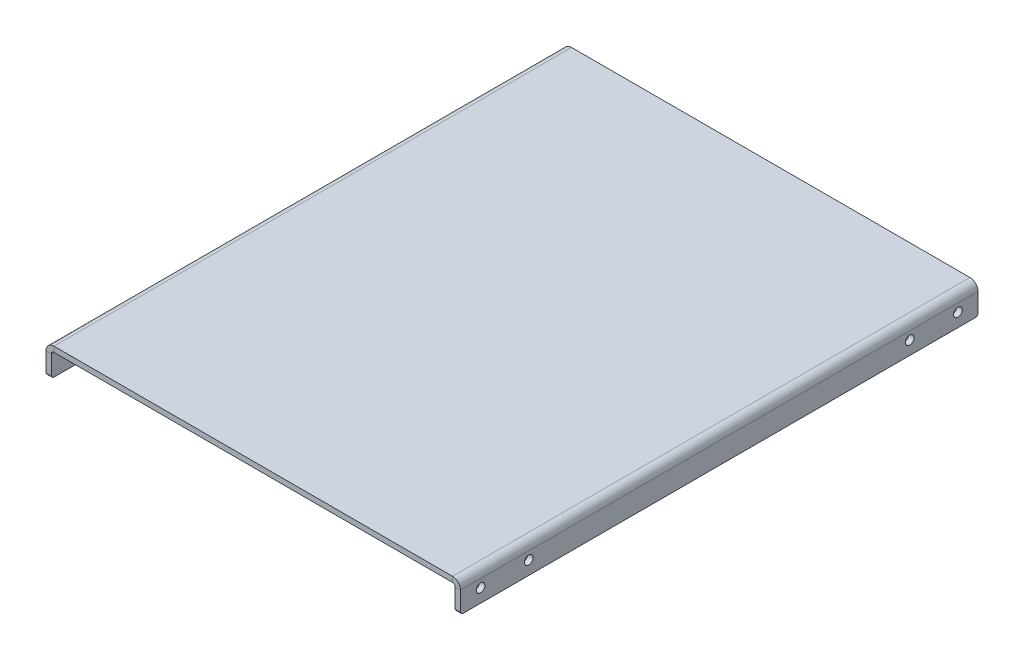
ISO-10303-21;
HEADER;
FILE_DESCRIPTION(('STEP AP214'),'2;1');
FILE_NAME('part.step','',(''),(''),'','','');
FILE_SCHEMA(('AUTOMOTIVE_DESIGN { 1 0 10303 214 1 1 1 1 }'));
ENDSEC;
DATA;
#1=APPLICATION_CONTEXT('core data for automotive mechanical design processes');
#2=APPLICATION_PROTOCOL_DEFINITION('international standard','automotive_design',2000,#1);
#3=PRODUCT_CONTEXT('',#1,'mechanical');
#4=PRODUCT('Part','Part','',(#3));
#5=PRODUCT_RELATED_PRODUCT_CATEGORY('part','',(#4));
#6=PRODUCT_DEFINITION_FORMATION('','',#4);
#7=PRODUCT_DEFINITION_CONTEXT('part definition',#1,'design');
#8=PRODUCT_DEFINITION('design','',#6,#7);
#9=PRODUCT_DEFINITION_SHAPE('','',#8);
#10=(LENGTH_UNIT() NAMED_UNIT(*) SI_UNIT(.MILLI.,.METRE.));
#11=(NAMED_UNIT(*) PLANE_ANGLE_UNIT() SI_UNIT($,.RADIAN.));
#12=(NAMED_UNIT(*) SI_UNIT($,.STERADIAN.) SOLID_ANGLE_UNIT());
#13=UNCERTAINTY_MEASURE_WITH_UNIT(LENGTH_MEASURE(1.E-05),#10,'distance_accuracy_value','');
#14=(GEOMETRIC_REPRESENTATION_CONTEXT(3) GLOBAL_UNCERTAINTY_ASSIGNED_CONTEXT((#13)) GLOBAL_UNIT_ASSIGNED_CONTEXT((#10,
#11,#12)) REPRESENTATION_CONTEXT('',''));
#15=CARTESIAN_POINT('',(0.,0.,0.));
#16=DIRECTION('',(0.,0.,1.));
#17=DIRECTION('',(1.,0.,0.));
#18=AXIS2_PLACEMENT_3D('',#15,#16,#17);
#19=CARTESIAN_POINT('',(-155.,-4.,193.5));
#20=DIRECTION('',(0.,0.,1.));
#21=DIRECTION('',(1.,0.,0.));
#22=AXIS2_PLACEMENT_3D('',#19,#20,#21);
#23=PLANE('',#22);
#24=DIRECTION('',(0.,-1.,0.));
#25=VECTOR('',#24,1.);
#26=CARTESIAN_POINT('',(149.,-4.,193.5));
#27=LINE('',#26,#25);
#28=CARTESIAN_POINT('',(149.,0.,193.5));
#29=VERTEX_POINT('',#28);
#30=CARTESIAN_POINT('',(149.,-4.,193.5));
#31=VERTEX_POINT('',#30);
#32=EDGE_CURVE('E262',#29,#31,#27,.T.);
#33=ORIENTED_EDGE('',*,*,#32,.F.);
#34=DIRECTION('',(1.,0.,0.));
#35=VECTOR('',#34,1.);
#36=CARTESIAN_POINT('',(-155.,0.,193.5));
#37=LINE('',#36,#35);
#38=CARTESIAN_POINT('',(-149.,0.,193.5));
#39=VERTEX_POINT('',#38);
#40=EDGE_CURVE('E237',#39,#29,#37,.T.);
#41=ORIENTED_EDGE('',*,*,#40,.F.);
#42=DIRECTION('',(0.,-1.,0.));
#43=VECTOR('',#42,1.);
#44=CARTESIAN_POINT('',(-149.,-4.,193.5));
#45=LINE('',#44,#43);
#46=CARTESIAN_POINT('',(-149.,-4.,193.5));
#47=VERTEX_POINT('',#46);
#48=EDGE_CURVE('E260',#39,#47,#45,.T.);
#49=ORIENTED_EDGE('',*,*,#48,.T.);
#50=DIRECTION('',(1.,0.,0.));
#51=VECTOR('',#50,1.);
#52=CARTESIAN_POINT('',(-155.,-4.,193.5));
#53=LINE('',#52,#51);
#54=EDGE_CURVE('E186',#47,#31,#53,.T.);
#55=ORIENTED_EDGE('',*,*,#54,.T.);
#56=EDGE_LOOP('',(#33,#41,#49,#55));
#57=FACE_BOUND('',#56,.T.);
#58=ADVANCED_FACE('F39',(#57),#23,.T.);
#59=CARTESIAN_POINT('',(-149.,-6.,193.5));
#60=DIRECTION('',(0.,0.,1.));
#61=DIRECTION('',(1.,0.,0.));
#62=AXIS2_PLACEMENT_3D('',#59,#60,#61);
#63=PLANE('',#62);
#64=ORIENTED_EDGE('',*,*,#48,.F.);
#65=CARTESIAN_POINT('',(-149.,-6.,193.5));
#66=DIRECTION('',(0.,0.,1.));
#67=DIRECTION('',(1.,0.,0.));
#68=AXIS2_PLACEMENT_3D('',#65,#66,#67);
#69=CIRCLE('',#68,6.);
#70=CARTESIAN_POINT('',(-155.,-5.99999999999999,193.5));
#71=VERTEX_POINT('',#70);
#72=EDGE_CURVE('E238',#39,#71,#69,.T.);
#73=ORIENTED_EDGE('',*,*,#72,.T.);
#74=DIRECTION('',(1.,0.,0.));
#75=VECTOR('',#74,1.);
#76=CARTESIAN_POINT('',(-151.,-6.,193.5));
#77=LINE('',#76,#75);
#78=CARTESIAN_POINT('',(-151.,-6.,193.5));
#79=VERTEX_POINT('',#78);
#80=EDGE_CURVE('E257',#71,#79,#77,.T.);
#81=ORIENTED_EDGE('',*,*,#80,.T.);
#82=CARTESIAN_POINT('',(-149.,-6.,193.5));
#83=DIRECTION('',(0.,0.,-1.));
#84=DIRECTION('',(-1.,0.,0.));
#85=AXIS2_PLACEMENT_3D('',#82,#83,#84);
#86=CIRCLE('',#85,2.);
#87=EDGE_CURVE('E177',#47,#79,#86,.F.);
#88=ORIENTED_EDGE('',*,*,#87,.F.);
#89=EDGE_LOOP('',(#64,#73,#81,#88));
#90=FACE_BOUND('',#89,.T.);
#91=ADVANCED_FACE('F436',(#90),#63,.T.);
#92=CARTESIAN_POINT('',(-151.,-22.,193.5));
#93=DIRECTION('',(0.,0.,1.));
#94=DIRECTION('',(0.,1.,0.));
#95=AXIS2_PLACEMENT_3D('',#92,#93,#94);
#96=PLANE('',#95);
#97=DIRECTION('',(0.,1.,0.));
#98=VECTOR('',#97,1.);
#99=CARTESIAN_POINT('',(-155.,-22.,193.5));
#100=LINE('',#99,#98);
#101=CARTESIAN_POINT('',(-155.,-20.,193.5));
#102=VERTEX_POINT('',#101);
#103=EDGE_CURVE('E242',#102,#71,#100,.T.);
#104=ORIENTED_EDGE('',*,*,#103,.F.);
#105=DIRECTION('',(-1.,0.,0.));
#106=VECTOR('',#105,1.);
#107=CARTESIAN_POINT('',(-151.,-20.,193.5));
#108=LINE('',#107,#106);
#109=CARTESIAN_POINT('',(-151.,-20.,193.5));
#110=VERTEX_POINT('',#109);
#111=EDGE_CURVE('E47',#102,#110,#108,.F.);
#112=ORIENTED_EDGE('',*,*,#111,.T.);
#113=DIRECTION('',(0.,1.,0.));
#114=VECTOR('',#113,1.);
#115=CARTESIAN_POINT('',(-151.,-22.,193.5));
#116=LINE('',#115,#114);
#117=EDGE_CURVE('E301',#110,#79,#116,.T.);
#118=ORIENTED_EDGE('',*,*,#117,.T.);
#119=ORIENTED_EDGE('',*,*,#80,.F.);
#120=EDGE_LOOP('',(#104,#112,#118,#119));
#121=FACE_BOUND('',#120,.T.);
#122=ADVANCED_FACE('F299',(#121),#96,.T.);
#123=CARTESIAN_POINT('',(-151.,-22.,193.5));
#124=DIRECTION('',(0.,1.,0.));
#125=DIRECTION('',(0.,0.,-1.));
#126=AXIS2_PLACEMENT_3D('',#123,#124,#125);
#127=PLANE('',#126);
#128=DIRECTION('',(0.,0.,1.));
#129=VECTOR('',#128,1.);
#130=CARTESIAN_POINT('',(-155.,-22.,193.5));
#131=LINE('',#130,#129);
#132=CARTESIAN_POINT('',(-155.,-22.,191.5));
#133=VERTEX_POINT('',#132);
#134=CARTESIAN_POINT('',(-155.,-22.,-191.5));
#135=VERTEX_POINT('',#134);
#136=EDGE_CURVE('E229',#133,#135,#131,.F.);
#137=ORIENTED_EDGE('',*,*,#136,.T.);
#138=DIRECTION('',(-1.,0.,0.));
#139=VECTOR('',#138,1.);
#140=CARTESIAN_POINT('',(-151.,-22.,-191.5));
#141=LINE('',#140,#139);
#142=CARTESIAN_POINT('',(-151.,-22.,-191.5));
#143=VERTEX_POINT('',#142);
#144=EDGE_CURVE('E267',#135,#143,#141,.F.);
#145=ORIENTED_EDGE('',*,*,#144,.T.);
#146=DIRECTION('',(0.,0.,-1.));
#147=VECTOR('',#146,1.);
#148=CARTESIAN_POINT('',(-151.,-22.,193.5));
#149=LINE('',#148,#147);
#150=CARTESIAN_POINT('',(-151.,-22.,191.5));
#151=VERTEX_POINT('',#150);
#152=EDGE_CURVE('E308',#151,#143,#149,.T.);
#153=ORIENTED_EDGE('',*,*,#152,.F.);
#154=DIRECTION('',(1.,0.,0.));
#155=VECTOR('',#154,1.);
#156=CARTESIAN_POINT('',(-151.,-22.,191.5));
#157=LINE('',#156,#155);
#158=EDGE_CURVE('E264',#151,#133,#157,.F.);
#159=ORIENTED_EDGE('',*,*,#158,.T.);
#160=EDGE_LOOP('',(#137,#145,#153,#159));
#161=FACE_BOUND('',#160,.T.);
#162=ADVANCED_FACE('F463',(#161),#127,.F.);
#163=CARTESIAN_POINT('',(-151.,-22.,-193.5));
#164=DIRECTION('',(0.,0.,1.));
#165=DIRECTION('',(0.,1.,0.));
#166=AXIS2_PLACEMENT_3D('',#163,#164,#165);
#167=PLANE('',#166);
#168=DIRECTION('',(0.,1.,0.));
#169=VECTOR('',#168,1.);
#170=CARTESIAN_POINT('',(-151.,-22.,-193.5));
#171=LINE('',#170,#169);
#172=CARTESIAN_POINT('',(-151.,-20.,-193.5));
#173=VERTEX_POINT('',#172);
#174=CARTESIAN_POINT('',(-151.,-6.,-193.5));
#175=VERTEX_POINT('',#174);
#176=EDGE_CURVE('E309',#173,#175,#171,.T.);
#177=ORIENTED_EDGE('',*,*,#176,.F.);
#178=DIRECTION('',(-1.,0.,0.));
#179=VECTOR('',#178,1.);
#180=CARTESIAN_POINT('',(-151.,-20.,-193.5));
#181=LINE('',#180,#179);
#182=CARTESIAN_POINT('',(-155.,-20.,-193.5));
#183=VERTEX_POINT('',#182);
#184=EDGE_CURVE('E274',#173,#183,#181,.T.);
#185=ORIENTED_EDGE('',*,*,#184,.T.);
#186=DIRECTION('',(0.,1.,0.));
#187=VECTOR('',#186,1.);
#188=CARTESIAN_POINT('',(-155.,-22.,-193.5));
#189=LINE('',#188,#187);
#190=CARTESIAN_POINT('',(-155.,-6.,-193.5));
#191=VERTEX_POINT('',#190);
#192=EDGE_CURVE('E240',#183,#191,#189,.T.);
#193=ORIENTED_EDGE('',*,*,#192,.T.);
#194=DIRECTION('',(1.,0.,0.));
#195=VECTOR('',#194,1.);
#196=CARTESIAN_POINT('',(-151.,-6.,-193.5));
#197=LINE('',#196,#195);
#198=EDGE_CURVE('E166',#191,#175,#197,.T.);
#199=ORIENTED_EDGE('',*,*,#198,.T.);
#200=EDGE_LOOP('',(#177,#185,#193,#199));
#201=FACE_BOUND('',#200,.T.);
#202=ADVANCED_FACE('F467',(#201),#167,.F.);
#203=CARTESIAN_POINT('',(-149.,-6.,-193.5));
#204=DIRECTION('',(0.,0.,-1.));
#205=DIRECTION('',(-1.,0.,0.));
#206=AXIS2_PLACEMENT_3D('',#203,#204,#205);
#207=PLANE('',#206);
#208=ORIENTED_EDGE('',*,*,#198,.F.);
#209=CARTESIAN_POINT('',(-149.,-6.,-193.5));
#210=DIRECTION('',(0.,0.,1.));
#211=DIRECTION('',(1.,0.,0.));
#212=AXIS2_PLACEMENT_3D('',#209,#210,#211);
#213=CIRCLE('',#212,6.);
#214=CARTESIAN_POINT('',(-149.,0.,-193.5));
#215=VERTEX_POINT('',#214);
#216=EDGE_CURVE('E161',#191,#215,#213,.F.);
#217=ORIENTED_EDGE('',*,*,#216,.T.);
#218=DIRECTION('',(0.,-1.,0.));
#219=VECTOR('',#218,1.);
#220=CARTESIAN_POINT('',(-149.,-4.,-193.5));
#221=LINE('',#220,#219);
#222=CARTESIAN_POINT('',(-149.,-4.,-193.5));
#223=VERTEX_POINT('',#222);
#224=EDGE_CURVE('E154',#215,#223,#221,.T.);
#225=ORIENTED_EDGE('',*,*,#224,.T.);
#226=CARTESIAN_POINT('',(-149.,-6.,-193.5));
#227=DIRECTION('',(0.,0.,1.));
#228=DIRECTION('',(1.,0.,0.));
#229=AXIS2_PLACEMENT_3D('',#226,#227,#228);
#230=CIRCLE('',#229,2.);
#231=EDGE_CURVE('E158',#175,#223,#230,.F.);
#232=ORIENTED_EDGE('',*,*,#231,.F.);
#233=EDGE_LOOP('',(#208,#217,#225,#232));
#234=FACE_BOUND('',#233,.T.);
#235=ADVANCED_FACE('F157',(#234),#207,.T.);
#236=CARTESIAN_POINT('',(-155.,-4.,-193.5));
#237=DIRECTION('',(0.,0.,1.));
#238=DIRECTION('',(1.,0.,0.));
#239=AXIS2_PLACEMENT_3D('',#236,#237,#238);
#240=PLANE('',#239);
#241=ORIENTED_EDGE('',*,*,#224,.F.);
#242=DIRECTION('',(1.,0.,0.));
#243=VECTOR('',#242,1.);
#244=CARTESIAN_POINT('',(-155.,0.,-193.5));
#245=LINE('',#244,#243);
#246=CARTESIAN_POINT('',(149.,0.,-193.5));
#247=VERTEX_POINT('',#246);
#248=EDGE_CURVE('E235',#215,#247,#245,.T.);
#249=ORIENTED_EDGE('',*,*,#248,.T.);
#250=DIRECTION('',(0.,-1.,0.));
#251=VECTOR('',#250,1.);
#252=CARTESIAN_POINT('',(149.,-4.,-193.5));
#253=LINE('',#252,#251);
#254=CARTESIAN_POINT('',(149.,-4.,-193.5));
#255=VERTEX_POINT('',#254);
#256=EDGE_CURVE('E167',#247,#255,#253,.T.);
#257=ORIENTED_EDGE('',*,*,#256,.T.);
#258=DIRECTION('',(1.,0.,0.));
#259=VECTOR('',#258,1.);
#260=CARTESIAN_POINT('',(-155.,-4.,-193.5));
#261=LINE('',#260,#259);
#262=EDGE_CURVE('E181',#223,#255,#261,.T.);
#263=ORIENTED_EDGE('',*,*,#262,.F.);
#264=EDGE_LOOP('',(#241,#249,#257,#263));
#265=FACE_BOUND('',#264,.T.);
#266=ADVANCED_FACE('F182',(#265),#240,.F.);
#267=CARTESIAN_POINT('',(149.,-6.,-193.5));
#268=DIRECTION('',(0.,0.,1.));
#269=DIRECTION('',(1.,0.,0.));
#270=AXIS2_PLACEMENT_3D('',#267,#268,#269);
#271=PLANE('',#270);
#272=ORIENTED_EDGE('',*,*,#256,.F.);
#273=CARTESIAN_POINT('',(149.,-6.,-193.5));
#274=DIRECTION('',(0.,0.,1.));
#275=DIRECTION('',(1.,0.,0.));
#276=AXIS2_PLACEMENT_3D('',#273,#274,#275);
#277=CIRCLE('',#276,6.);
#278=CARTESIAN_POINT('',(155.,-6.,-193.5));
#279=VERTEX_POINT('',#278);
#280=EDGE_CURVE('E230',#247,#279,#277,.F.);
#281=ORIENTED_EDGE('',*,*,#280,.T.);
#282=DIRECTION('',(-1.,0.,0.));
#283=VECTOR('',#282,1.);
#284=CARTESIAN_POINT('',(151.,-6.,-193.5));
#285=LINE('',#284,#283);
#286=CARTESIAN_POINT('',(151.,-6.,-193.5));
#287=VERTEX_POINT('',#286);
#288=EDGE_CURVE('E252',#279,#287,#285,.T.);
#289=ORIENTED_EDGE('',*,*,#288,.T.);
#290=CARTESIAN_POINT('',(149.,-6.,-193.5));
#291=DIRECTION('',(0.,0.,-1.));
#292=DIRECTION('',(-1.,0.,0.));
#293=AXIS2_PLACEMENT_3D('',#290,#291,#292);
#294=CIRCLE('',#293,2.);
#295=EDGE_CURVE('E206',#255,#287,#294,.T.);
#296=ORIENTED_EDGE('',*,*,#295,.F.);
#297=EDGE_LOOP('',(#272,#281,#289,#296));
#298=FACE_BOUND('',#297,.T.);
#299=ADVANCED_FACE('F494',(#298),#271,.F.);
#300=CARTESIAN_POINT('',(151.,0.,-193.5));
#301=DIRECTION('',(0.,0.,-1.));
#302=DIRECTION('',(0.,1.,0.));
#303=AXIS2_PLACEMENT_3D('',#300,#301,#302);
#304=PLANE('',#303);
#305=DIRECTION('',(0.,1.,0.));
#306=VECTOR('',#305,1.);
#307=CARTESIAN_POINT('',(155.,0.,-193.5));
#308=LINE('',#307,#306);
#309=CARTESIAN_POINT('',(155.,-20.,-193.5));
#310=VERTEX_POINT('',#309);
#311=EDGE_CURVE('E226',#279,#310,#308,.F.);
#312=ORIENTED_EDGE('',*,*,#311,.T.);
#313=DIRECTION('',(-1.,0.,0.));
#314=VECTOR('',#313,1.);
#315=CARTESIAN_POINT('',(151.,-20.,-193.5));
#316=LINE('',#315,#314);
#317=CARTESIAN_POINT('',(151.,-20.,-193.5));
#318=VERTEX_POINT('',#317);
#319=EDGE_CURVE('E280',#310,#318,#316,.T.);
#320=ORIENTED_EDGE('',*,*,#319,.T.);
#321=DIRECTION('',(0.,1.,0.));
#322=VECTOR('',#321,1.);
#323=CARTESIAN_POINT('',(151.,0.,-193.5));
#324=LINE('',#323,#322);
#325=EDGE_CURVE('E311',#287,#318,#324,.F.);
#326=ORIENTED_EDGE('',*,*,#325,.F.);
#327=ORIENTED_EDGE('',*,*,#288,.F.);
#328=EDGE_LOOP('',(#312,#320,#326,#327));
#329=FACE_BOUND('',#328,.T.);
#330=ADVANCED_FACE('F330',(#329),#304,.T.);
#331=CARTESIAN_POINT('',(151.,-22.,193.5));
#332=DIRECTION('',(0.,-1.,0.));
#333=DIRECTION('',(0.,0.,-1.));
#334=AXIS2_PLACEMENT_3D('',#331,#332,#333);
#335=PLANE('',#334);
#336=DIRECTION('',(0.,0.,-1.));
#337=VECTOR('',#336,1.);
#338=CARTESIAN_POINT('',(151.,-22.,193.5));
#339=LINE('',#338,#337);
#340=CARTESIAN_POINT('',(151.,-22.,191.5));
#341=VERTEX_POINT('',#340);
#342=CARTESIAN_POINT('',(151.,-22.,-191.5));
#343=VERTEX_POINT('',#342);
#344=EDGE_CURVE('E196',#341,#343,#339,.T.);
#345=ORIENTED_EDGE('',*,*,#344,.T.);
#346=DIRECTION('',(-1.,0.,0.));
#347=VECTOR('',#346,1.);
#348=CARTESIAN_POINT('',(151.,-22.,-191.5));
#349=LINE('',#348,#347);
#350=CARTESIAN_POINT('',(155.,-22.,-191.5));
#351=VERTEX_POINT('',#350);
#352=EDGE_CURVE('E60',#343,#351,#349,.F.);
#353=ORIENTED_EDGE('',*,*,#352,.T.);
#354=DIRECTION('',(0.,0.,-1.));
#355=VECTOR('',#354,1.);
#356=CARTESIAN_POINT('',(155.,-22.,193.5));
#357=LINE('',#356,#355);
#358=CARTESIAN_POINT('',(155.,-22.,191.5));
#359=VERTEX_POINT('',#358);
#360=EDGE_CURVE('E224',#359,#351,#357,.T.);
#361=ORIENTED_EDGE('',*,*,#360,.F.);
#362=DIRECTION('',(1.,0.,0.));
#363=VECTOR('',#362,1.);
#364=CARTESIAN_POINT('',(151.,-22.,191.5));
#365=LINE('',#364,#363);
#366=EDGE_CURVE('E287',#359,#341,#365,.F.);
#367=ORIENTED_EDGE('',*,*,#366,.T.);
#368=EDGE_LOOP('',(#345,#353,#361,#367));
#369=FACE_BOUND('',#368,.T.);
#370=ADVANCED_FACE('F318',(#369),#335,.T.);
#371=CARTESIAN_POINT('',(151.,0.,193.5));
#372=DIRECTION('',(0.,0.,-1.));
#373=DIRECTION('',(0.,1.,0.));
#374=AXIS2_PLACEMENT_3D('',#371,#372,#373);
#375=PLANE('',#374);
#376=DIRECTION('',(0.,1.,0.));
#377=VECTOR('',#376,1.);
#378=CARTESIAN_POINT('',(151.,0.,193.5));
#379=LINE('',#378,#377);
#380=CARTESIAN_POINT('',(151.,-6.,193.5));
#381=VERTEX_POINT('',#380);
#382=CARTESIAN_POINT('',(151.,-20.,193.5));
#383=VERTEX_POINT('',#382);
#384=EDGE_CURVE('E192',#381,#383,#379,.F.);
#385=ORIENTED_EDGE('',*,*,#384,.T.);
#386=DIRECTION('',(-1.,0.,0.));
#387=VECTOR('',#386,1.);
#388=CARTESIAN_POINT('',(151.,-20.,193.5));
#389=LINE('',#388,#387);
#390=CARTESIAN_POINT('',(155.,-20.,193.5));
#391=VERTEX_POINT('',#390);
#392=EDGE_CURVE('E11',#383,#391,#389,.F.);
#393=ORIENTED_EDGE('',*,*,#392,.T.);
#394=DIRECTION('',(0.,1.,0.));
#395=VECTOR('',#394,1.);
#396=CARTESIAN_POINT('',(155.,0.,193.5));
#397=LINE('',#396,#395);
#398=CARTESIAN_POINT('',(155.,-6.,193.5));
#399=VERTEX_POINT('',#398);
#400=EDGE_CURVE('E220',#399,#391,#397,.F.);
#401=ORIENTED_EDGE('',*,*,#400,.F.);
#402=DIRECTION('',(-1.,0.,0.));
#403=VECTOR('',#402,1.);
#404=CARTESIAN_POINT('',(151.,-6.,193.5));
#405=LINE('',#404,#403);
#406=EDGE_CURVE('E205',#399,#381,#405,.T.);
#407=ORIENTED_EDGE('',*,*,#406,.T.);
#408=EDGE_LOOP('',(#385,#393,#401,#407));
#409=FACE_BOUND('',#408,.T.);
#410=ADVANCED_FACE('F342',(#409),#375,.F.);
#411=CARTESIAN_POINT('',(149.,-6.,193.5));
#412=DIRECTION('',(0.,0.,-1.));
#413=DIRECTION('',(-1.,0.,0.));
#414=AXIS2_PLACEMENT_3D('',#411,#412,#413);
#415=PLANE('',#414);
#416=CARTESIAN_POINT('',(149.,-6.,193.5));
#417=DIRECTION('',(0.,0.,1.));
#418=DIRECTION('',(1.,0.,0.));
#419=AXIS2_PLACEMENT_3D('',#416,#417,#418);
#420=CIRCLE('',#419,6.);
#421=EDGE_CURVE('E233',#399,#29,#420,.T.);
#422=ORIENTED_EDGE('',*,*,#421,.T.);
#423=ORIENTED_EDGE('',*,*,#32,.T.);
#424=CARTESIAN_POINT('',(149.,-6.,193.5));
#425=DIRECTION('',(0.,0.,1.));
#426=DIRECTION('',(1.,0.,0.));
#427=AXIS2_PLACEMENT_3D('',#424,#425,#426);
#428=CIRCLE('',#427,2.);
#429=EDGE_CURVE('E178',#381,#31,#428,.T.);
#430=ORIENTED_EDGE('',*,*,#429,.F.);
#431=ORIENTED_EDGE('',*,*,#406,.F.);
#432=EDGE_LOOP('',(#422,#423,#430,#431));
#433=FACE_BOUND('',#432,.T.);
#434=ADVANCED_FACE('F345',(#433),#415,.F.);
#435=CARTESIAN_POINT('',(151.,0.,193.5));
#436=DIRECTION('',(1.,0.,0.));
#437=DIRECTION('',(0.,0.,-1.));
#438=AXIS2_PLACEMENT_3D('',#435,#436,#437);
#439=PLANE('',#438);
#440=CARTESIAN_POINT('',(151.,-12.,178.5));
#441=DIRECTION('',(1.,0.,0.));
#442=DIRECTION('',(0.,0.,-1.));
#443=AXIS2_PLACEMENT_3D('',#440,#441,#442);
#444=CIRCLE('',#443,3.24999999999994);
#445=CARTESIAN_POINT('',(151.,-12.,175.25));
#446=VERTEX_POINT('',#445);
#447=EDGE_CURVE('E387',#446,#446,#444,.T.);
#448=ORIENTED_EDGE('',*,*,#447,.T.);
#449=EDGE_LOOP('',(#448));
#450=FACE_BOUND('',#449,.T.);
#451=CARTESIAN_POINT('',(151.,-12.,142.5));
#452=DIRECTION('',(1.,0.,0.));
#453=DIRECTION('',(0.,0.,-1.));
#454=AXIS2_PLACEMENT_3D('',#451,#452,#453);
#455=CIRCLE('',#454,3.24999999999994);
#456=CARTESIAN_POINT('',(151.,-12.,139.25));
#457=VERTEX_POINT('',#456);
#458=EDGE_CURVE('E375',#457,#457,#455,.T.);
#459=ORIENTED_EDGE('',*,*,#458,.T.);
#460=EDGE_LOOP('',(#459));
#461=FACE_BOUND('',#460,.T.);
#462=CARTESIAN_POINT('',(151.,-12.,-142.5));
#463=DIRECTION('',(1.,0.,0.));
#464=DIRECTION('',(0.,0.,-1.));
#465=AXIS2_PLACEMENT_3D('',#462,#463,#464);
#466=CIRCLE('',#465,3.24999999999994);
#467=CARTESIAN_POINT('',(151.,-12.,-145.75));
#468=VERTEX_POINT('',#467);
#469=EDGE_CURVE('E363',#468,#468,#466,.T.);
#470=ORIENTED_EDGE('',*,*,#469,.T.);
#471=EDGE_LOOP('',(#470));
#472=FACE_BOUND('',#471,.T.);
#473=CARTESIAN_POINT('',(151.,-12.,-178.5));
#474=DIRECTION('',(1.,0.,0.));
#475=DIRECTION('',(0.,0.,-1.));
#476=AXIS2_PLACEMENT_3D('',#473,#474,#475);
#477=CIRCLE('',#476,3.24999999999994);
#478=CARTESIAN_POINT('',(151.,-12.,-181.75));
#479=VERTEX_POINT('',#478);
#480=EDGE_CURVE('E234',#479,#479,#477,.T.);
#481=ORIENTED_EDGE('',*,*,#480,.T.);
#482=EDGE_LOOP('',(#481));
#483=FACE_BOUND('',#482,.T.);
#484=ORIENTED_EDGE('',*,*,#325,.T.);
#485=CARTESIAN_POINT('',(151.,-20.,-191.5));
#486=DIRECTION('',(1.,0.,0.));
#487=DIRECTION('',(0.,0.,-1.));
#488=AXIS2_PLACEMENT_3D('',#485,#486,#487);
#489=CIRCLE('',#488,2.);
#490=EDGE_CURVE('E285',#318,#343,#489,.F.);
#491=ORIENTED_EDGE('',*,*,#490,.T.);
#492=ORIENTED_EDGE('',*,*,#344,.F.);
#493=CARTESIAN_POINT('',(151.,-20.,191.5));
#494=DIRECTION('',(1.,0.,0.));
#495=DIRECTION('',(0.,0.,-1.));
#496=AXIS2_PLACEMENT_3D('',#493,#494,#495);
#497=CIRCLE('',#496,2.);
#498=EDGE_CURVE('E283',#341,#383,#497,.F.);
#499=ORIENTED_EDGE('',*,*,#498,.T.);
#500=ORIENTED_EDGE('',*,*,#384,.F.);
#501=DIRECTION('',(0.,0.,-1.));
#502=VECTOR('',#501,1.);
#503=CARTESIAN_POINT('',(151.,-6.,-193.5));
#504=LINE('',#503,#502);
#505=EDGE_CURVE('E194',#381,#287,#504,.T.);
#506=ORIENTED_EDGE('',*,*,#505,.T.);
#507=EDGE_LOOP('',(#484,#491,#492,#499,#500,#506));
#508=FACE_BOUND('',#507,.T.);
#509=ADVANCED_FACE('F340',(#450,#461,#472,#483,#508),#439,.F.);
#510=CARTESIAN_POINT('',(-151.,-22.,193.5));
#511=DIRECTION('',(-1.,0.,0.));
#512=DIRECTION('',(0.,0.,1.));
#513=AXIS2_PLACEMENT_3D('',#510,#511,#512);
#514=PLANE('',#513);
#515=CARTESIAN_POINT('',(-151.,-12.,178.5));
#516=DIRECTION('',(-1.,0.,0.));
#517=DIRECTION('',(0.,0.,1.));
#518=AXIS2_PLACEMENT_3D('',#515,#516,#517);
#519=CIRCLE('',#518,3.24999999999994);
#520=CARTESIAN_POINT('',(-151.,-12.,181.75));
#521=VERTEX_POINT('',#520);
#522=EDGE_CURVE('E393',#521,#521,#519,.T.);
#523=ORIENTED_EDGE('',*,*,#522,.T.);
#524=EDGE_LOOP('',(#523));
#525=FACE_BOUND('',#524,.T.);
#526=CARTESIAN_POINT('',(-151.,-12.,142.5));
#527=DIRECTION('',(-1.,0.,0.));
#528=DIRECTION('',(0.,0.,1.));
#529=AXIS2_PLACEMENT_3D('',#526,#527,#528);
#530=CIRCLE('',#529,3.24999999999994);
#531=CARTESIAN_POINT('',(-151.,-12.,145.75));
#532=VERTEX_POINT('',#531);
#533=EDGE_CURVE('E378',#532,#532,#530,.T.);
#534=ORIENTED_EDGE('',*,*,#533,.T.);
#535=EDGE_LOOP('',(#534));
#536=FACE_BOUND('',#535,.T.);
#537=CARTESIAN_POINT('',(-151.,-12.,-142.5));
#538=DIRECTION('',(-1.,0.,0.));
#539=DIRECTION('',(0.,0.,1.));
#540=AXIS2_PLACEMENT_3D('',#537,#538,#539);
#541=CIRCLE('',#540,3.24999999999994);
#542=CARTESIAN_POINT('',(-151.,-12.,-139.25));
#543=VERTEX_POINT('',#542);
#544=EDGE_CURVE('E369',#543,#543,#541,.T.);
#545=ORIENTED_EDGE('',*,*,#544,.T.);
#546=EDGE_LOOP('',(#545));
#547=FACE_BOUND('',#546,.T.);
#548=CARTESIAN_POINT('',(-151.,-12.,-178.5));
#549=DIRECTION('',(-1.,0.,0.));
#550=DIRECTION('',(0.,0.,1.));
#551=AXIS2_PLACEMENT_3D('',#548,#549,#550);
#552=CIRCLE('',#551,3.24999999999994);
#553=CARTESIAN_POINT('',(-151.,-12.,-175.25));
#554=VERTEX_POINT('',#553);
#555=EDGE_CURVE('E357',#554,#554,#552,.T.);
#556=ORIENTED_EDGE('',*,*,#555,.T.);
#557=EDGE_LOOP('',(#556));
#558=FACE_BOUND('',#557,.T.);
#559=ORIENTED_EDGE('',*,*,#152,.T.);
#560=CARTESIAN_POINT('',(-151.,-20.,-191.5));
#561=DIRECTION('',(-1.,0.,0.));
#562=DIRECTION('',(0.,0.,1.));
#563=AXIS2_PLACEMENT_3D('',#560,#561,#562);
#564=CIRCLE('',#563,2.);
#565=EDGE_CURVE('E272',#143,#173,#564,.F.);
#566=ORIENTED_EDGE('',*,*,#565,.T.);
#567=ORIENTED_EDGE('',*,*,#176,.T.);
#568=DIRECTION('',(0.,0.,-1.));
#569=VECTOR('',#568,1.);
#570=CARTESIAN_POINT('',(-151.,-6.,193.5));
#571=LINE('',#570,#569);
#572=EDGE_CURVE('E176',#175,#79,#571,.F.);
#573=ORIENTED_EDGE('',*,*,#572,.T.);
#574=ORIENTED_EDGE('',*,*,#117,.F.);
#575=CARTESIAN_POINT('',(-151.,-20.,191.5));
#576=DIRECTION('',(-1.,0.,0.));
#577=DIRECTION('',(0.,0.,1.));
#578=AXIS2_PLACEMENT_3D('',#575,#576,#577);
#579=CIRCLE('',#578,2.);
#580=EDGE_CURVE('E270',#110,#151,#579,.F.);
#581=ORIENTED_EDGE('',*,*,#580,.T.);
#582=EDGE_LOOP('',(#559,#566,#567,#573,#574,#581));
#583=FACE_BOUND('',#582,.T.);
#584=ADVANCED_FACE('F306',(#525,#536,#547,#558,#583),#514,.F.);
#585=CARTESIAN_POINT('',(-155.,-4.,193.5));
#586=DIRECTION('',(0.,1.,0.));
#587=DIRECTION('',(0.,0.,1.));
#588=AXIS2_PLACEMENT_3D('',#585,#586,#587);
#589=PLANE('',#588);
#590=ORIENTED_EDGE('',*,*,#262,.T.);
#591=DIRECTION('',(0.,0.,-1.));
#592=VECTOR('',#591,1.);
#593=CARTESIAN_POINT('',(149.,-4.,193.5));
#594=LINE('',#593,#592);
#595=EDGE_CURVE('E203',#255,#31,#594,.F.);
#596=ORIENTED_EDGE('',*,*,#595,.T.);
#597=ORIENTED_EDGE('',*,*,#54,.F.);
#598=DIRECTION('',(0.,0.,-1.));
#599=VECTOR('',#598,1.);
#600=CARTESIAN_POINT('',(-149.,-4.,-193.5));
#601=LINE('',#600,#599);
#602=EDGE_CURVE('E174',#47,#223,#601,.T.);
#603=ORIENTED_EDGE('',*,*,#602,.T.);
#604=EDGE_LOOP('',(#590,#596,#597,#603));
#605=FACE_BOUND('',#604,.T.);
#606=ADVANCED_FACE('F189',(#605),#589,.F.);
#607=CARTESIAN_POINT('',(-149.,-6.,193.5));
#608=DIRECTION('',(0.,0.,1.));
#609=DIRECTION('',(1.,0.,0.));
#610=AXIS2_PLACEMENT_3D('',#607,#608,#609);
#611=CYLINDRICAL_SURFACE('',#610,2.);
#612=ORIENTED_EDGE('',*,*,#87,.T.);
#613=ORIENTED_EDGE('',*,*,#572,.F.);
#614=ORIENTED_EDGE('',*,*,#231,.T.);
#615=ORIENTED_EDGE('',*,*,#602,.F.);
#616=EDGE_LOOP('',(#612,#613,#614,#615));
#617=FACE_BOUND('',#616,.T.);
#618=ADVANCED_FACE('F172',(#617),#611,.F.);
#619=CARTESIAN_POINT('',(149.,-6.,193.5));
#620=DIRECTION('',(0.,0.,1.));
#621=DIRECTION('',(1.,0.,0.));
#622=AXIS2_PLACEMENT_3D('',#619,#620,#621);
#623=CYLINDRICAL_SURFACE('',#622,2.);
#624=ORIENTED_EDGE('',*,*,#429,.T.);
#625=ORIENTED_EDGE('',*,*,#595,.F.);
#626=ORIENTED_EDGE('',*,*,#295,.T.);
#627=ORIENTED_EDGE('',*,*,#505,.F.);
#628=EDGE_LOOP('',(#624,#625,#626,#627));
#629=FACE_BOUND('',#628,.T.);
#630=ADVANCED_FACE('F348',(#629),#623,.F.);
#631=CARTESIAN_POINT('',(155.,0.,193.5));
#632=DIRECTION('',(1.,0.,0.));
#633=DIRECTION('',(0.,0.,-1.));
#634=AXIS2_PLACEMENT_3D('',#631,#632,#633);
#635=PLANE('',#634);
#636=CARTESIAN_POINT('',(155.,-12.,178.5));
#637=DIRECTION('',(1.,0.,0.));
#638=DIRECTION('',(0.,0.,-1.));
#639=AXIS2_PLACEMENT_3D('',#636,#637,#638);
#640=CIRCLE('',#639,3.24999999999994);
#641=CARTESIAN_POINT('',(155.,-12.,175.25));
#642=VERTEX_POINT('',#641);
#643=EDGE_CURVE('E390',#642,#642,#640,.T.);
#644=ORIENTED_EDGE('',*,*,#643,.F.);
#645=EDGE_LOOP('',(#644));
#646=FACE_BOUND('',#645,.T.);
#647=CARTESIAN_POINT('',(155.,-12.,142.5));
#648=DIRECTION('',(1.,0.,0.));
#649=DIRECTION('',(0.,0.,-1.));
#650=AXIS2_PLACEMENT_3D('',#647,#648,#649);
#651=CIRCLE('',#650,3.24999999999994);
#652=CARTESIAN_POINT('',(155.,-12.,139.25));
#653=VERTEX_POINT('',#652);
#654=EDGE_CURVE('E381',#653,#653,#651,.T.);
#655=ORIENTED_EDGE('',*,*,#654,.F.);
#656=EDGE_LOOP('',(#655));
#657=FACE_BOUND('',#656,.T.);
#658=CARTESIAN_POINT('',(155.,-12.,-142.5));
#659=DIRECTION('',(1.,0.,0.));
#660=DIRECTION('',(0.,0.,-1.));
#661=AXIS2_PLACEMENT_3D('',#658,#659,#660);
#662=CIRCLE('',#661,3.24999999999994);
#663=CARTESIAN_POINT('',(155.,-12.,-145.75));
#664=VERTEX_POINT('',#663);
#665=EDGE_CURVE('E366',#664,#664,#662,.T.);
#666=ORIENTED_EDGE('',*,*,#665,.F.);
#667=EDGE_LOOP('',(#666));
#668=FACE_BOUND('',#667,.T.);
#669=CARTESIAN_POINT('',(155.,-12.,-178.5));
#670=DIRECTION('',(1.,0.,0.));
#671=DIRECTION('',(0.,0.,-1.));
#672=AXIS2_PLACEMENT_3D('',#669,#670,#671);
#673=CIRCLE('',#672,3.24999999999994);
#674=CARTESIAN_POINT('',(155.,-12.,-181.75));
#675=VERTEX_POINT('',#674);
#676=EDGE_CURVE('E354',#675,#675,#673,.T.);
#677=ORIENTED_EDGE('',*,*,#676,.F.);
#678=EDGE_LOOP('',(#677));
#679=FACE_BOUND('',#678,.T.);
#680=ORIENTED_EDGE('',*,*,#360,.T.);
#681=CARTESIAN_POINT('',(155.,-20.,-191.5));
#682=DIRECTION('',(1.,0.,0.));
#683=DIRECTION('',(0.,0.,-1.));
#684=AXIS2_PLACEMENT_3D('',#681,#682,#683);
#685=CIRCLE('',#684,2.);
#686=EDGE_CURVE('E293',#351,#310,#685,.T.);
#687=ORIENTED_EDGE('',*,*,#686,.T.);
#688=ORIENTED_EDGE('',*,*,#311,.F.);
#689=DIRECTION('',(0.,0.,-1.));
#690=VECTOR('',#689,1.);
#691=CARTESIAN_POINT('',(155.,-6.,193.5));
#692=LINE('',#691,#690);
#693=EDGE_CURVE('E212',#399,#279,#692,.T.);
#694=ORIENTED_EDGE('',*,*,#693,.F.);
#695=ORIENTED_EDGE('',*,*,#400,.T.);
#696=CARTESIAN_POINT('',(155.,-20.,191.5));
#697=DIRECTION('',(1.,0.,0.));
#698=DIRECTION('',(0.,0.,-1.));
#699=AXIS2_PLACEMENT_3D('',#696,#697,#698);
#700=CIRCLE('',#699,2.);
#701=EDGE_CURVE('E291',#391,#359,#700,.T.);
#702=ORIENTED_EDGE('',*,*,#701,.T.);
#703=EDGE_LOOP('',(#680,#687,#688,#694,#695,#702));
#704=FACE_BOUND('',#703,.T.);
#705=ADVANCED_FACE('F327',(#646,#657,#668,#679,#704),#635,.T.);
#706=CARTESIAN_POINT('',(-155.,-22.,193.5));
#707=DIRECTION('',(-1.,0.,0.));
#708=DIRECTION('',(0.,0.,1.));
#709=AXIS2_PLACEMENT_3D('',#706,#707,#708);
#710=PLANE('',#709);
#711=CARTESIAN_POINT('',(-155.,-12.,178.5));
#712=DIRECTION('',(1.,0.,0.));
#713=DIRECTION('',(0.,0.,-1.));
#714=AXIS2_PLACEMENT_3D('',#711,#712,#713);
#715=CIRCLE('',#714,3.24999999999992);
#716=CARTESIAN_POINT('',(-155.,-12.,175.25));
#717=VERTEX_POINT('',#716);
#718=EDGE_CURVE('E396',#717,#717,#715,.T.);
#719=ORIENTED_EDGE('',*,*,#718,.T.);
#720=EDGE_LOOP('',(#719));
#721=FACE_BOUND('',#720,.T.);
#722=CARTESIAN_POINT('',(-155.,-12.,142.5));
#723=DIRECTION('',(1.,0.,0.));
#724=DIRECTION('',(0.,0.,-1.));
#725=AXIS2_PLACEMENT_3D('',#722,#723,#724);
#726=CIRCLE('',#725,3.24999999999992);
#727=CARTESIAN_POINT('',(-155.,-12.,139.25));
#728=VERTEX_POINT('',#727);
#729=EDGE_CURVE('E384',#728,#728,#726,.T.);
#730=ORIENTED_EDGE('',*,*,#729,.T.);
#731=EDGE_LOOP('',(#730));
#732=FACE_BOUND('',#731,.T.);
#733=CARTESIAN_POINT('',(-155.,-12.,-142.5));
#734=DIRECTION('',(1.,0.,0.));
#735=DIRECTION('',(0.,0.,-1.));
#736=AXIS2_PLACEMENT_3D('',#733,#734,#735);
#737=CIRCLE('',#736,3.24999999999992);
#738=CARTESIAN_POINT('',(-155.,-12.,-145.75));
#739=VERTEX_POINT('',#738);
#740=EDGE_CURVE('E372',#739,#739,#737,.T.);
#741=ORIENTED_EDGE('',*,*,#740,.T.);
#742=EDGE_LOOP('',(#741));
#743=FACE_BOUND('',#742,.T.);
#744=CARTESIAN_POINT('',(-155.,-12.,-178.5));
#745=DIRECTION('',(1.,0.,0.));
#746=DIRECTION('',(0.,0.,-1.));
#747=AXIS2_PLACEMENT_3D('',#744,#745,#746);
#748=CIRCLE('',#747,3.24999999999992);
#749=CARTESIAN_POINT('',(-155.,-12.,-181.75));
#750=VERTEX_POINT('',#749);
#751=EDGE_CURVE('E360',#750,#750,#748,.T.);
#752=ORIENTED_EDGE('',*,*,#751,.T.);
#753=EDGE_LOOP('',(#752));
#754=FACE_BOUND('',#753,.T.);
#755=ORIENTED_EDGE('',*,*,#192,.F.);
#756=CARTESIAN_POINT('',(-155.,-20.,-191.5));
#757=DIRECTION('',(-1.,0.,0.));
#758=DIRECTION('',(0.,0.,1.));
#759=AXIS2_PLACEMENT_3D('',#756,#757,#758);
#760=CIRCLE('',#759,2.);
#761=EDGE_CURVE('E278',#183,#135,#760,.T.);
#762=ORIENTED_EDGE('',*,*,#761,.T.);
#763=ORIENTED_EDGE('',*,*,#136,.F.);
#764=CARTESIAN_POINT('',(-155.,-20.,191.5));
#765=DIRECTION('',(-1.,0.,0.));
#766=DIRECTION('',(0.,0.,1.));
#767=AXIS2_PLACEMENT_3D('',#764,#765,#766);
#768=CIRCLE('',#767,2.);
#769=EDGE_CURVE('E276',#133,#102,#768,.T.);
#770=ORIENTED_EDGE('',*,*,#769,.T.);
#771=ORIENTED_EDGE('',*,*,#103,.T.);
#772=DIRECTION('',(0.,0.,1.));
#773=VECTOR('',#772,1.);
#774=CARTESIAN_POINT('',(-155.,-6.,193.5));
#775=LINE('',#774,#773);
#776=EDGE_CURVE('E215',#191,#71,#775,.T.);
#777=ORIENTED_EDGE('',*,*,#776,.F.);
#778=EDGE_LOOP('',(#755,#762,#763,#770,#771,#777));
#779=FACE_BOUND('',#778,.T.);
#780=ADVANCED_FACE('F400',(#721,#732,#743,#754,#779),#710,.T.);
#781=CARTESIAN_POINT('',(-155.,0.,193.5));
#782=DIRECTION('',(0.,1.,0.));
#783=DIRECTION('',(0.,0.,1.));
#784=AXIS2_PLACEMENT_3D('',#781,#782,#783);
#785=PLANE('',#784);
#786=ORIENTED_EDGE('',*,*,#248,.F.);
#787=DIRECTION('',(0.,0.,1.));
#788=VECTOR('',#787,1.);
#789=CARTESIAN_POINT('',(-149.,0.,193.5));
#790=LINE('',#789,#788);
#791=EDGE_CURVE('E218',#39,#215,#790,.F.);
#792=ORIENTED_EDGE('',*,*,#791,.F.);
#793=ORIENTED_EDGE('',*,*,#40,.T.);
#794=DIRECTION('',(0.,0.,1.));
#795=VECTOR('',#794,1.);
#796=CARTESIAN_POINT('',(149.,0.,193.5));
#797=LINE('',#796,#795);
#798=EDGE_CURVE('E209',#247,#29,#797,.T.);
#799=ORIENTED_EDGE('',*,*,#798,.F.);
#800=EDGE_LOOP('',(#786,#792,#793,#799));
#801=FACE_BOUND('',#800,.T.);
#802=ADVANCED_FACE('F475',(#801),#785,.T.);
#803=CARTESIAN_POINT('',(-149.,-6.,193.5));
#804=DIRECTION('',(0.,0.,1.));
#805=DIRECTION('',(1.,0.,0.));
#806=AXIS2_PLACEMENT_3D('',#803,#804,#805);
#807=CYLINDRICAL_SURFACE('',#806,6.);
#808=ORIENTED_EDGE('',*,*,#72,.F.);
#809=ORIENTED_EDGE('',*,*,#791,.T.);
#810=ORIENTED_EDGE('',*,*,#216,.F.);
#811=ORIENTED_EDGE('',*,*,#776,.T.);
#812=EDGE_LOOP('',(#808,#809,#810,#811));
#813=FACE_BOUND('',#812,.T.);
#814=ADVANCED_FACE('F470',(#813),#807,.T.);
#815=CARTESIAN_POINT('',(149.,-6.,193.5));
#816=DIRECTION('',(0.,0.,1.));
#817=DIRECTION('',(1.,0.,0.));
#818=AXIS2_PLACEMENT_3D('',#815,#816,#817);
#819=CYLINDRICAL_SURFACE('',#818,6.);
#820=ORIENTED_EDGE('',*,*,#421,.F.);
#821=ORIENTED_EDGE('',*,*,#693,.T.);
#822=ORIENTED_EDGE('',*,*,#280,.F.);
#823=ORIENTED_EDGE('',*,*,#798,.T.);
#824=EDGE_LOOP('',(#820,#821,#822,#823));
#825=FACE_BOUND('',#824,.T.);
#826=ADVANCED_FACE('F336',(#825),#819,.T.);
#827=CARTESIAN_POINT('',(-151.,-20.,-191.5));
#828=DIRECTION('',(1.,0.,0.));
#829=DIRECTION('',(0.,0.,-1.));
#830=AXIS2_PLACEMENT_3D('',#827,#828,#829);
#831=CYLINDRICAL_SURFACE('',#830,2.);
#832=ORIENTED_EDGE('',*,*,#761,.F.);
#833=ORIENTED_EDGE('',*,*,#184,.F.);
#834=ORIENTED_EDGE('',*,*,#565,.F.);
#835=ORIENTED_EDGE('',*,*,#144,.F.);
#836=EDGE_LOOP('',(#832,#833,#834,#835));
#837=FACE_BOUND('',#836,.T.);
#838=ADVANCED_FACE('F447',(#837),#831,.T.);
#839=CARTESIAN_POINT('',(151.,-20.,-191.5));
#840=DIRECTION('',(-1.,0.,0.));
#841=DIRECTION('',(0.,0.,1.));
#842=AXIS2_PLACEMENT_3D('',#839,#840,#841);
#843=CYLINDRICAL_SURFACE('',#842,2.);
#844=ORIENTED_EDGE('',*,*,#686,.F.);
#845=ORIENTED_EDGE('',*,*,#352,.F.);
#846=ORIENTED_EDGE('',*,*,#490,.F.);
#847=ORIENTED_EDGE('',*,*,#319,.F.);
#848=EDGE_LOOP('',(#844,#845,#846,#847));
#849=FACE_BOUND('',#848,.T.);
#850=ADVANCED_FACE('F323',(#849),#843,.T.);
#851=CARTESIAN_POINT('',(-151.,-20.,191.5));
#852=DIRECTION('',(-1.,0.,0.));
#853=DIRECTION('',(0.,0.,1.));
#854=AXIS2_PLACEMENT_3D('',#851,#852,#853);
#855=CYLINDRICAL_SURFACE('',#854,2.);
#856=ORIENTED_EDGE('',*,*,#769,.F.);
#857=ORIENTED_EDGE('',*,*,#158,.F.);
#858=ORIENTED_EDGE('',*,*,#580,.F.);
#859=ORIENTED_EDGE('',*,*,#111,.F.);
#860=EDGE_LOOP('',(#856,#857,#858,#859));
#861=FACE_BOUND('',#860,.T.);
#862=ADVANCED_FACE('F431',(#861),#855,.T.);
#863=CARTESIAN_POINT('',(151.,-20.,191.5));
#864=DIRECTION('',(1.,0.,0.));
#865=DIRECTION('',(0.,0.,-1.));
#866=AXIS2_PLACEMENT_3D('',#863,#864,#865);
#867=CYLINDRICAL_SURFACE('',#866,2.);
#868=ORIENTED_EDGE('',*,*,#701,.F.);
#869=ORIENTED_EDGE('',*,*,#392,.F.);
#870=ORIENTED_EDGE('',*,*,#498,.F.);
#871=ORIENTED_EDGE('',*,*,#366,.F.);
#872=EDGE_LOOP('',(#868,#869,#870,#871));
#873=FACE_BOUND('',#872,.T.);
#874=ADVANCED_FACE('F41',(#873),#867,.T.);
#875=CARTESIAN_POINT('',(159.,-12.,-178.5));
#876=DIRECTION('',(1.,0.,0.));
#877=DIRECTION('',(0.,0.,-1.));
#878=AXIS2_PLACEMENT_3D('',#875,#876,#877);
#879=CYLINDRICAL_SURFACE('',#878,3.24999999999994);
#880=ORIENTED_EDGE('',*,*,#751,.F.);
#881=EDGE_LOOP('',(#880));
#882=FACE_BOUND('',#881,.T.);
#883=ORIENTED_EDGE('',*,*,#555,.F.);
#884=EDGE_LOOP('',(#883));
#885=FACE_BOUND('',#884,.T.);
#886=ADVANCED_FACE('F420',(#882,#885),#879,.F.);
#887=ORIENTED_EDGE('',*,*,#676,.T.);
#888=EDGE_LOOP('',(#887));
#889=FACE_BOUND('',#888,.T.);
#890=ORIENTED_EDGE('',*,*,#480,.F.);
#891=EDGE_LOOP('',(#890));
#892=FACE_BOUND('',#891,.T.);
#893=ADVANCED_FACE('F422',(#889,#892),#879,.F.);
#894=CARTESIAN_POINT('',(159.,-12.,-142.5));
#895=DIRECTION('',(1.,0.,0.));
#896=DIRECTION('',(0.,0.,-1.));
#897=AXIS2_PLACEMENT_3D('',#894,#895,#896);
#898=CYLINDRICAL_SURFACE('',#897,3.24999999999994);
#899=ORIENTED_EDGE('',*,*,#740,.F.);
#900=EDGE_LOOP('',(#899));
#901=FACE_BOUND('',#900,.T.);
#902=ORIENTED_EDGE('',*,*,#544,.F.);
#903=EDGE_LOOP('',(#902));
#904=FACE_BOUND('',#903,.T.);
#905=ADVANCED_FACE('F429',(#901,#904),#898,.F.);
#906=ORIENTED_EDGE('',*,*,#665,.T.);
#907=EDGE_LOOP('',(#906));
#908=FACE_BOUND('',#907,.T.);
#909=ORIENTED_EDGE('',*,*,#469,.F.);
#910=EDGE_LOOP('',(#909));
#911=FACE_BOUND('',#910,.T.);
#912=ADVANCED_FACE('F608',(#908,#911),#898,.F.);
#913=CARTESIAN_POINT('',(159.,-12.,142.5));
#914=DIRECTION('',(1.,0.,0.));
#915=DIRECTION('',(0.,0.,-1.));
#916=AXIS2_PLACEMENT_3D('',#913,#914,#915);
#917=CYLINDRICAL_SURFACE('',#916,3.24999999999994);
#918=ORIENTED_EDGE('',*,*,#729,.F.);
#919=EDGE_LOOP('',(#918));
#920=FACE_BOUND('',#919,.T.);
#921=ORIENTED_EDGE('',*,*,#533,.F.);
#922=EDGE_LOOP('',(#921));
#923=FACE_BOUND('',#922,.T.);
#924=ADVANCED_FACE('F617',(#920,#923),#917,.F.);
#925=ORIENTED_EDGE('',*,*,#654,.T.);
#926=EDGE_LOOP('',(#925));
#927=FACE_BOUND('',#926,.T.);
#928=ORIENTED_EDGE('',*,*,#458,.F.);
#929=EDGE_LOOP('',(#928));
#930=FACE_BOUND('',#929,.T.);
#931=ADVANCED_FACE('F407',(#927,#930),#917,.F.);
#932=CARTESIAN_POINT('',(159.,-12.,178.5));
#933=DIRECTION('',(1.,0.,0.));
#934=DIRECTION('',(0.,0.,-1.));
#935=AXIS2_PLACEMENT_3D('',#932,#933,#934);
#936=CYLINDRICAL_SURFACE('',#935,3.24999999999994);
#937=ORIENTED_EDGE('',*,*,#718,.F.);
#938=EDGE_LOOP('',(#937));
#939=FACE_BOUND('',#938,.T.);
#940=ORIENTED_EDGE('',*,*,#522,.F.);
#941=EDGE_LOOP('',(#940));
#942=FACE_BOUND('',#941,.T.);
#943=ADVANCED_FACE('F403',(#939,#942),#936,.F.);
#944=ORIENTED_EDGE('',*,*,#643,.T.);
#945=EDGE_LOOP('',(#944));
#946=FACE_BOUND('',#945,.T.);
#947=ORIENTED_EDGE('',*,*,#447,.F.);
#948=EDGE_LOOP('',(#947));
#949=FACE_BOUND('',#948,.T.);
#950=ADVANCED_FACE('F406',(#946,#949),#936,.F.);
#951=CLOSED_SHELL('',(#58,#91,#122,#162,#202,#235,#266,#299,#330,#370,#410,#434,#509,#584,#606,
#618,#630,#705,#780,#802,#814,#826,#838,#850,#862,#874,#886,#893,#905,#912,#924,#931,#943,#950));
#952=MANIFOLD_SOLID_BREP('B2',#951);
#953=ADVANCED_BREP_SHAPE_REPRESENTATION('',(#18,#952),#14);
#954=SHAPE_DEFINITION_REPRESENTATION(#9,#953);
ENDSEC;
END-ISO-10303-21;
